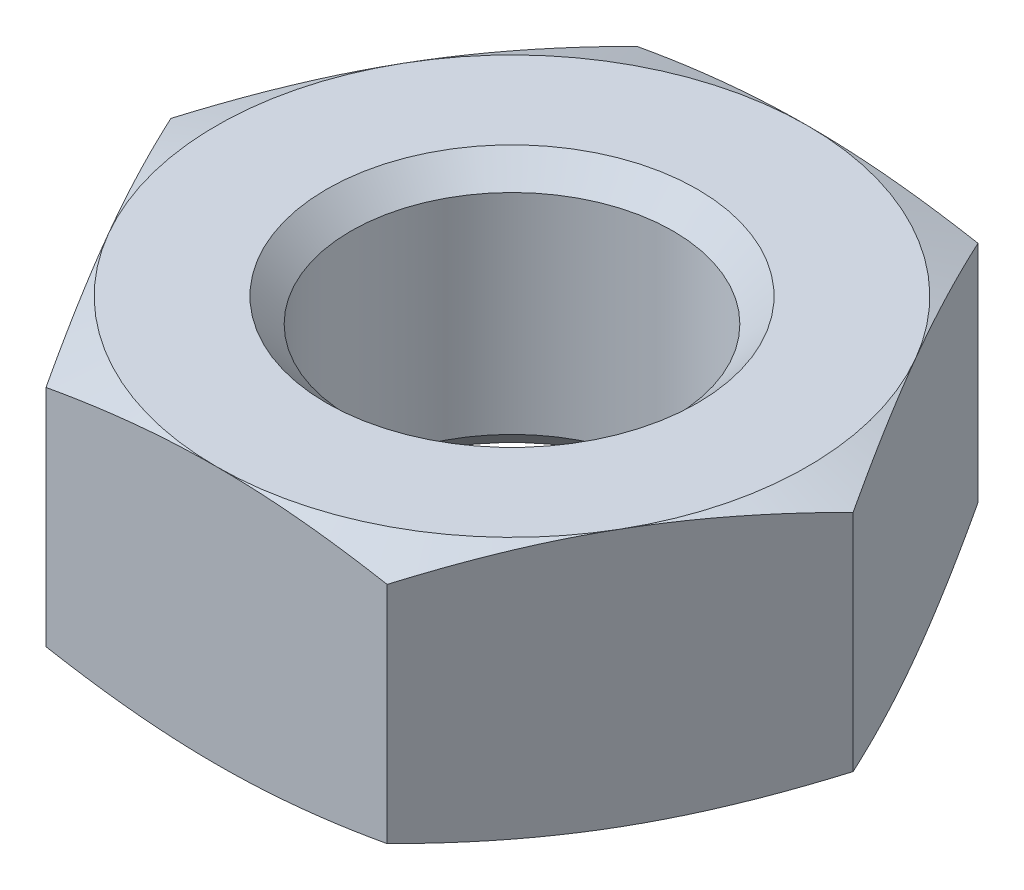
ISO-10303-21;
HEADER;
FILE_DESCRIPTION(('STEP AP214'),'2;1');
FILE_NAME('part.step','',(''),(''),'','','');
FILE_SCHEMA(('AUTOMOTIVE_DESIGN { 1 0 10303 214 1 1 1 1 }'));
ENDSEC;
DATA;
#1=APPLICATION_CONTEXT('core data for automotive mechanical design processes');
#2=APPLICATION_PROTOCOL_DEFINITION('international standard','automotive_design',2000,#1);
#3=PRODUCT_CONTEXT('',#1,'mechanical');
#4=PRODUCT('Part','Part','',(#3));
#5=PRODUCT_RELATED_PRODUCT_CATEGORY('part','',(#4));
#6=PRODUCT_DEFINITION_FORMATION('','',#4);
#7=PRODUCT_DEFINITION_CONTEXT('part definition',#1,'design');
#8=PRODUCT_DEFINITION('design','',#6,#7);
#9=PRODUCT_DEFINITION_SHAPE('','',#8);
#10=(LENGTH_UNIT() NAMED_UNIT(*) SI_UNIT(.MILLI.,.METRE.));
#11=(NAMED_UNIT(*) PLANE_ANGLE_UNIT() SI_UNIT($,.RADIAN.));
#12=(NAMED_UNIT(*) SI_UNIT($,.STERADIAN.) SOLID_ANGLE_UNIT());
#13=UNCERTAINTY_MEASURE_WITH_UNIT(LENGTH_MEASURE(1.E-05),#10,'distance_accuracy_value','');
#14=(GEOMETRIC_REPRESENTATION_CONTEXT(3) GLOBAL_UNCERTAINTY_ASSIGNED_CONTEXT((#13)) GLOBAL_UNIT_ASSIGNED_CONTEXT((#10,
#11,#12)) REPRESENTATION_CONTEXT('',''));
#15=CARTESIAN_POINT('',(0.,0.,0.));
#16=DIRECTION('',(0.,0.,1.));
#17=DIRECTION('',(1.,0.,0.));
#18=AXIS2_PLACEMENT_3D('',#15,#16,#17);
#19=CARTESIAN_POINT('',(1.587713240271,0.,2.75));
#20=DIRECTION('',(0.866025403784429,0.,0.500000000000017));
#21=DIRECTION('',(0.,-1.,0.));
#22=AXIS2_PLACEMENT_3D('',#19,#20,#21);
#23=PLANE('',#22);
#24=CARTESIAN_POINT('',(1.58771324026988,0.154842575777853,2.75000000000194));
#25=CARTESIAN_POINT('',(2.01313972089192,-1.79459256801417E-11,2.01313972067937));
#26=CARTESIAN_POINT('',(2.38156986055307,1.05739088548212E-11,1.3749999997466));
#27=(BOUNDED_CURVE() B_SPLINE_CURVE(2,(#24,#25,#26),.UNSPECIFIED.,.F.,
.F.) B_SPLINE_CURVE_WITH_KNOTS((3,3),(-1.63948333347943,-1.22556115981672),
.UNSPECIFIED.) CURVE() GEOMETRIC_REPRESENTATION_ITEM() RATIONAL_B_SPLINE_CURVE((2.50470126938003,
2.69844058684522,2.69844058680677)) REPRESENTATION_ITEM(''));
#28=CARTESIAN_POINT('',(1.58771324027139,0.15484257577773,2.75000000000067));
#29=VERTEX_POINT('',#28);
#30=CARTESIAN_POINT('',(2.38156986051846,2.84217500879855E-11,1.37499999985558));
#31=VERTEX_POINT('',#30);
#32=EDGE_CURVE('E356',#29,#31,#27,.T.);
#33=ORIENTED_EDGE('',*,*,#32,.T.);
#34=CARTESIAN_POINT('',(2.38156986055307,1.05739088548212E-11,1.3749999997466));
#35=CARTESIAN_POINT('',(2.75000000007855,3.90938809102792E-11,0.736860279048808));
#36=CARTESIAN_POINT('',(3.17542648054396,0.154842575777903,-2.45794130877548E-12));
#37=(BOUNDED_CURVE() B_SPLINE_CURVE(2,(#34,#35,#36),.UNSPECIFIED.,.F.,
.F.) B_SPLINE_CURVE_WITH_KNOTS((3,3),(-1.22556115981672,-0.811638986318215),
.UNSPECIFIED.) CURVE() GEOMETRIC_REPRESENTATION_ITEM() RATIONAL_B_SPLINE_CURVE((2.69844058680677,
2.69844058676833,2.50470126937997)) REPRESENTATION_ITEM(''));
#38=CARTESIAN_POINT('',(3.17542648054322,0.154842575777633,-7.75972364879314E-13));
#39=VERTEX_POINT('',#38);
#40=EDGE_CURVE('E347',#31,#39,#37,.T.);
#41=ORIENTED_EDGE('',*,*,#40,.T.);
#42=DIRECTION('',(0.,-1.,0.));
#43=VECTOR('',#42,1.);
#44=CARTESIAN_POINT('',(3.175426480543,0.,0.));
#45=LINE('',#44,#43);
#46=CARTESIAN_POINT('',(3.17542648050373,2.24515742435737,3.84921201960077E-09));
#47=VERTEX_POINT('',#46);
#48=EDGE_CURVE('E290',#47,#39,#45,.T.);
#49=ORIENTED_EDGE('',*,*,#48,.F.);
#50=CARTESIAN_POINT('',(2.38156986055307,2.40000000002772,1.3749999997466));
#51=CARTESIAN_POINT('',(2.74999999871458,2.3999999999992,0.736860281411279));
#52=CARTESIAN_POINT('',(3.17542647715035,2.24515742546731,5.87545311471844E-09));
#53=(BOUNDED_CURVE() B_SPLINE_CURVE(2,(#50,#51,#52),.UNSPECIFIED.,.F.,
.F.) B_SPLINE_CURVE_WITH_KNOTS((3,3),(1.2255611598137,1.63948333173724),
.UNSPECIFIED.) CURVE() GEOMETRIC_REPRESENTATION_ITEM() RATIONAL_B_SPLINE_CURVE((2.69844058649833,
2.69844058645989,2.50470127052817)) REPRESENTATION_ITEM(''));
#54=CARTESIAN_POINT('',(2.38156986051847,2.40000000000987,1.37499999985558));
#55=VERTEX_POINT('',#54);
#56=EDGE_CURVE('E28',#55,#47,#53,.T.);
#57=ORIENTED_EDGE('',*,*,#56,.F.);
#58=CARTESIAN_POINT('',(1.58771324026949,2.24515742423204,2.75000000000262));
#59=CARTESIAN_POINT('',(2.01313972089177,2.40000000005624,2.01313972067965));
#60=CARTESIAN_POINT('',(2.38156986055307,2.40000000002772,1.3749999997466));
#61=(BOUNDED_CURVE() B_SPLINE_CURVE(2,(#58,#59,#60),.UNSPECIFIED.,.F.,
.F.) B_SPLINE_CURVE_WITH_KNOTS((3,3),(0.811638986193381,1.2255611598137),
.UNSPECIFIED.) CURVE() GEOMETRIC_REPRESENTATION_ITEM() RATIONAL_B_SPLINE_CURVE((2.50470126909357,
2.69844058653678,2.69844058649833)) REPRESENTATION_ITEM(''));
#62=CARTESIAN_POINT('',(1.58771324027039,2.24515742423237,2.75000000000105));
#63=VERTEX_POINT('',#62);
#64=EDGE_CURVE('E11',#63,#55,#61,.T.);
#65=ORIENTED_EDGE('',*,*,#64,.F.);
#66=DIRECTION('',(0.,1.,0.));
#67=VECTOR('',#66,1.);
#68=CARTESIAN_POINT('',(1.587713240271,0.,2.75));
#69=LINE('',#68,#67);
#70=EDGE_CURVE('E226',#29,#63,#69,.T.);
#71=ORIENTED_EDGE('',*,*,#70,.F.);
#72=EDGE_LOOP('',(#33,#41,#49,#57,#65,#71));
#73=FACE_BOUND('',#72,.T.);
#74=ADVANCED_FACE('F17',(#73),#23,.T.);
#75=CARTESIAN_POINT('',(0.,2.24422836879512,0.));
#76=DIRECTION('',(0.,-1.,0.));
#77=DIRECTION('',(0.,0.,-1.));
#78=AXIS2_PLACEMENT_3D('',#75,#76,#77);
#79=CONICAL_SURFACE('',#78,3.17797903937844,1.22173047637774);
#80=CARTESIAN_POINT('',(1.58771324027227,2.24515742423236,2.75));
#81=CARTESIAN_POINT('',(0.736860279185908,2.40000000002758,2.75));
#82=CARTESIAN_POINT('',(0.,2.40000000002758,2.75));
#83=(BOUNDED_CURVE() B_SPLINE_CURVE(2,(#80,#81,#82),.UNSPECIFIED.,.F.,
.F.) B_SPLINE_CURVE_WITH_KNOTS((3,3),(0.811638986187635,1.22556115972299),
.UNSPECIFIED.) CURVE() GEOMETRIC_REPRESENTATION_ITEM() RATIONAL_B_SPLINE_CURVE((2.50470126908056,
2.69844058648372,2.69844058648372)) REPRESENTATION_ITEM(''));
#84=CARTESIAN_POINT('',(0.,2.40000000001873,2.75000000002433));
#85=VERTEX_POINT('',#84);
#86=EDGE_CURVE('E219',#63,#85,#83,.T.);
#87=ORIENTED_EDGE('',*,*,#86,.F.);
#88=ORIENTED_EDGE('',*,*,#64,.T.);
#89=CARTESIAN_POINT('',(0.,2.40000000000987,0.));
#90=DIRECTION('',(0.,1.,0.));
#91=DIRECTION('',(0.,0.,-1.));
#92=AXIS2_PLACEMENT_3D('',#89,#90,#91);
#93=CIRCLE('',#92,2.75000000004866);
#94=EDGE_CURVE('E200',#85,#55,#93,.T.);
#95=ORIENTED_EDGE('',*,*,#94,.F.);
#96=EDGE_LOOP('',(#87,#88,#95));
#97=FACE_BOUND('',#96,.T.);
#98=ADVANCED_FACE('F527',(#97),#79,.T.);
#99=CARTESIAN_POINT('',(0.,2.24422836879512,0.));
#100=DIRECTION('',(0.,-1.,0.));
#101=DIRECTION('',(0.,0.,-1.));
#102=AXIS2_PLACEMENT_3D('',#99,#100,#101);
#103=CONICAL_SURFACE('',#102,3.17797903937844,1.22173047637774);
#104=ORIENTED_EDGE('',*,*,#56,.T.);
#105=CARTESIAN_POINT('',(2.38156986055342,2.40000000002757,-1.3749999997468));
#106=CARTESIAN_POINT('',(2.75000000139461,2.39999999999905,-0.736860276770116));
#107=CARTESIAN_POINT('',(3.17542648381784,2.24515742304054,5.67218316571169E-09));
#108=(BOUNDED_CURVE() B_SPLINE_CURVE(2,(#105,#106,#107),.UNSPECIFIED.,.F.,
.F.) B_SPLINE_CURVE_WITH_KNOTS((3,3),(1.22556115981364,1.63948333474769),
.UNSPECIFIED.) CURVE() GEOMETRIC_REPRESENTATION_ITEM() RATIONAL_B_SPLINE_CURVE((2.69844058649794,
2.69844058645949,2.50470126770962)) REPRESENTATION_ITEM(''));
#109=CARTESIAN_POINT('',(2.38156986051864,2.40000000000987,-1.37499999985568));
#110=VERTEX_POINT('',#109);
#111=EDGE_CURVE('E98',#110,#47,#108,.T.);
#112=ORIENTED_EDGE('',*,*,#111,.F.);
#113=CARTESIAN_POINT('',(0.,2.40000000000987,0.));
#114=DIRECTION('',(0.,1.,0.));
#115=DIRECTION('',(0.,0.,-1.));
#116=AXIS2_PLACEMENT_3D('',#113,#114,#115);
#117=CIRCLE('',#116,2.75000000004866);
#118=EDGE_CURVE('E206',#55,#110,#117,.T.);
#119=ORIENTED_EDGE('',*,*,#118,.F.);
#120=EDGE_LOOP('',(#104,#112,#119));
#121=FACE_BOUND('',#120,.T.);
#122=ADVANCED_FACE('F526',(#121),#103,.T.);
#123=CARTESIAN_POINT('',(0.,2.24422836879512,0.));
#124=DIRECTION('',(0.,-1.,0.));
#125=DIRECTION('',(0.,0.,-1.));
#126=AXIS2_PLACEMENT_3D('',#123,#124,#125);
#127=CONICAL_SURFACE('',#126,3.17797903937844,1.22173047637774);
#128=CARTESIAN_POINT('',(1.58771324027013,2.24515742423203,-2.7500000000023));
#129=CARTESIAN_POINT('',(2.01313972089222,2.40000000005609,-2.01313972067965));
#130=CARTESIAN_POINT('',(2.38156986055342,2.40000000002757,-1.3749999997468));
#131=(BOUNDED_CURVE() B_SPLINE_CURVE(2,(#128,#129,#130),.UNSPECIFIED.,.F.,
.F.) B_SPLINE_CURVE_WITH_KNOTS((3,3),(0.811638986193514,1.22556115981364),
.UNSPECIFIED.) CURVE() GEOMETRIC_REPRESENTATION_ITEM() RATIONAL_B_SPLINE_CURVE((2.50470126909338,
2.69844058653638,2.69844058649794)) REPRESENTATION_ITEM(''));
#132=CARTESIAN_POINT('',(1.58771324027185,2.24515742423208,-2.75000000000114));
#133=VERTEX_POINT('',#132);
#134=EDGE_CURVE('E270',#133,#110,#131,.T.);
#135=ORIENTED_EDGE('',*,*,#134,.F.);
#136=CARTESIAN_POINT('',(1.58771324027373,2.2451574242321,-2.75));
#137=CARTESIAN_POINT('',(0.736860279186496,2.40000000002758,-2.75));
#138=CARTESIAN_POINT('',(0.,2.40000000002758,-2.75));
#139=(BOUNDED_CURVE() B_SPLINE_CURVE(2,(#136,#137,#138),.UNSPECIFIED.,.F.,
.F.) B_SPLINE_CURVE_WITH_KNOTS((3,3),(-1.63948333325867,-1.22556115972299),
.UNSPECIFIED.) CURVE() GEOMETRIC_REPRESENTATION_ITEM() RATIONAL_B_SPLINE_CURVE((2.50470126908025,
2.69844058648372,2.69844058648372)) REPRESENTATION_ITEM(''));
#140=CARTESIAN_POINT('',(0.,2.40000000001873,-2.75000000002433));
#141=VERTEX_POINT('',#140);
#142=EDGE_CURVE('E167',#133,#141,#139,.T.);
#143=ORIENTED_EDGE('',*,*,#142,.T.);
#144=CARTESIAN_POINT('',(0.,2.40000000000987,0.));
#145=DIRECTION('',(0.,1.,0.));
#146=DIRECTION('',(0.,0.,-1.));
#147=AXIS2_PLACEMENT_3D('',#144,#145,#146);
#148=CIRCLE('',#147,2.75000000004866);
#149=EDGE_CURVE('E380',#110,#141,#148,.T.);
#150=ORIENTED_EDGE('',*,*,#149,.F.);
#151=EDGE_LOOP('',(#135,#143,#150));
#152=FACE_BOUND('',#151,.T.);
#153=ADVANCED_FACE('F525',(#152),#127,.T.);
#154=CARTESIAN_POINT('',(0.,2.24422836879512,0.));
#155=DIRECTION('',(0.,-1.,0.));
#156=DIRECTION('',(0.,0.,-1.));
#157=AXIS2_PLACEMENT_3D('',#154,#155,#156);
#158=CONICAL_SURFACE('',#157,3.17797903937844,1.22173047637774);
#159=CARTESIAN_POINT('',(0.,2.40000000002758,-2.75));
#160=CARTESIAN_POINT('',(-0.73686027637031,2.40000000002758,-2.75));
#161=CARTESIAN_POINT('',(-1.58771323326697,2.24515742550722,-2.75));
#162=(BOUNDED_CURVE() B_SPLINE_CURVE(2,(#159,#160,#161),.UNSPECIFIED.,.F.,
.F.) B_SPLINE_CURVE_WITH_KNOTS((3,3),(-1.22556115972299,-0.811638987769262),
.UNSPECIFIED.) CURVE() GEOMETRIC_REPRESENTATION_ITEM() RATIONAL_B_SPLINE_CURVE((2.69844058648372,
2.69844058648372,2.50470127056114)) REPRESENTATION_ITEM(''));
#163=CARTESIAN_POINT('',(-1.58771323689944,2.24515742464228,-2.75000000179593));
#164=VERTEX_POINT('',#163);
#165=EDGE_CURVE('E217',#141,#164,#162,.T.);
#166=ORIENTED_EDGE('',*,*,#165,.T.);
#167=CARTESIAN_POINT('',(-1.58771323716036,2.24515742310041,-2.75000000538778));
#168=CARTESIAN_POINT('',(-2.01313971964214,2.40000000005624,-2.01313972284407));
#169=CARTESIAN_POINT('',(-2.38156986055307,2.40000000002772,-1.3749999997466));
#170=(BOUNDED_CURVE() B_SPLINE_CURVE(2,(#167,#168,#169),.UNSPECIFIED.,.F.,
.F.) B_SPLINE_CURVE_WITH_KNOTS((3,3),(-1.63948333468148,-1.22556115965561),
.UNSPECIFIED.) CURVE() GEOMETRIC_REPRESENTATION_ITEM() RATIONAL_B_SPLINE_CURVE((2.50470126778893,
2.69844058654712,2.69844058650868)) REPRESENTATION_ITEM(''));
#171=CARTESIAN_POINT('',(-2.38156986051847,2.40000000000987,-1.37499999985557));
#172=VERTEX_POINT('',#171);
#173=EDGE_CURVE('E218',#164,#172,#170,.T.);
#174=ORIENTED_EDGE('',*,*,#173,.T.);
#175=CARTESIAN_POINT('',(0.,2.40000000000987,0.));
#176=DIRECTION('',(0.,1.,0.));
#177=DIRECTION('',(0.,0.,-1.));
#178=AXIS2_PLACEMENT_3D('',#175,#176,#177);
#179=CIRCLE('',#178,2.75000000004866);
#180=EDGE_CURVE('E278',#141,#172,#179,.T.);
#181=ORIENTED_EDGE('',*,*,#180,.F.);
#182=EDGE_LOOP('',(#166,#174,#181));
#183=FACE_BOUND('',#182,.T.);
#184=ADVANCED_FACE('F519',(#183),#158,.T.);
#185=CARTESIAN_POINT('',(0.,2.24422836879512,0.));
#186=DIRECTION('',(0.,-1.,0.));
#187=DIRECTION('',(0.,0.,-1.));
#188=AXIS2_PLACEMENT_3D('',#185,#186,#187);
#189=CONICAL_SURFACE('',#188,3.17797903937844,1.22173047637774);
#190=CARTESIAN_POINT('',(-2.38156986055307,2.40000000002772,-1.3749999997466));
#191=CARTESIAN_POINT('',(-2.74999999867052,2.3999999999992,-0.73686028148758));
#192=CARTESIAN_POINT('',(-3.17542647704074,2.24515742550721,-6.06529224605319E-09));
#193=(BOUNDED_CURVE() B_SPLINE_CURVE(2,(#190,#191,#192),.UNSPECIFIED.,.F.,
.F.) B_SPLINE_CURVE_WITH_KNOTS((3,3),(-1.22556115965561,-0.811638987779946),
.UNSPECIFIED.) CURVE() GEOMETRIC_REPRESENTATION_ITEM() RATIONAL_B_SPLINE_CURVE((2.69844058650868,
2.69844058647023,2.5047012705841)) REPRESENTATION_ITEM(''));
#194=CARTESIAN_POINT('',(-3.17542648041227,2.24515742464226,-3.81749868933998E-09));
#195=VERTEX_POINT('',#194);
#196=EDGE_CURVE('E246',#172,#195,#193,.T.);
#197=ORIENTED_EDGE('',*,*,#196,.T.);
#198=CARTESIAN_POINT('',(-3.17542648365342,2.24515742310039,-5.38740257120665E-09));
#199=CARTESIAN_POINT('',(-2.75000000132853,2.39999999999905,0.736860276884577));
#200=CARTESIAN_POINT('',(-2.38156986055341,2.40000000002757,1.3749999997468));
#201=(BOUNDED_CURVE() B_SPLINE_CURVE(2,(#198,#199,#200),.UNSPECIFIED.,.F.,
.F.) B_SPLINE_CURVE_WITH_KNOTS((3,3),(-1.63948333467344,-1.22556115981364),
.UNSPECIFIED.) CURVE() GEOMETRIC_REPRESENTATION_ITEM() RATIONAL_B_SPLINE_CURVE((2.50470126777912,
2.69844058645949,2.69844058649794)) REPRESENTATION_ITEM(''));
#202=CARTESIAN_POINT('',(-2.38156986051864,2.40000000000987,1.37499999985568));
#203=VERTEX_POINT('',#202);
#204=EDGE_CURVE('E365',#195,#203,#201,.T.);
#205=ORIENTED_EDGE('',*,*,#204,.T.);
#206=CARTESIAN_POINT('',(0.,2.40000000000987,0.));
#207=DIRECTION('',(0.,1.,0.));
#208=DIRECTION('',(0.,0.,-1.));
#209=AXIS2_PLACEMENT_3D('',#206,#207,#208);
#210=CIRCLE('',#209,2.75000000004866);
#211=EDGE_CURVE('E309',#172,#203,#210,.T.);
#212=ORIENTED_EDGE('',*,*,#211,.F.);
#213=EDGE_LOOP('',(#197,#205,#212));
#214=FACE_BOUND('',#213,.T.);
#215=ADVANCED_FACE('F542',(#214),#189,.T.);
#216=CARTESIAN_POINT('',(0.,2.24422836879512,0.));
#217=DIRECTION('',(0.,-1.,0.));
#218=DIRECTION('',(0.,0.,-1.));
#219=AXIS2_PLACEMENT_3D('',#216,#217,#218);
#220=CONICAL_SURFACE('',#219,3.17797903937844,1.22173047637774);
#221=CARTESIAN_POINT('',(-2.38156986055341,2.40000000002757,1.3749999997468));
#222=CARTESIAN_POINT('',(-2.01313972225636,2.40000000005609,2.0131397183169));
#223=CARTESIAN_POINT('',(-1.58771324366415,2.24515742546735,2.74999999412369));
#224=(BOUNDED_CURVE() B_SPLINE_CURVE(2,(#221,#222,#223),.UNSPECIFIED.,.F.,
.F.) B_SPLINE_CURVE_WITH_KNOTS((3,3),(-1.22556115981364,-0.811638987726087),
.UNSPECIFIED.) CURVE() GEOMETRIC_REPRESENTATION_ITEM() RATIONAL_B_SPLINE_CURVE((2.69844058649794,
2.69844058653638,2.50470127052804)) REPRESENTATION_ITEM(''));
#225=CARTESIAN_POINT('',(-1.58771324358581,2.2451574243574,2.7499999980413));
#226=VERTEX_POINT('',#225);
#227=EDGE_CURVE('E252',#203,#226,#224,.T.);
#228=ORIENTED_EDGE('',*,*,#227,.T.);
#229=CARTESIAN_POINT('',(0.,2.40000000002758,2.75));
#230=CARTESIAN_POINT('',(-0.736860281818377,2.40000000002758,2.75));
#231=CARTESIAN_POINT('',(-1.58771324682194,2.24515742304042,2.75));
#232=(BOUNDED_CURVE() B_SPLINE_CURVE(2,(#229,#230,#231),.UNSPECIFIED.,.F.,
.F.) B_SPLINE_CURVE_WITH_KNOTS((3,3),(1.22556115972299,1.6394833347371),
.UNSPECIFIED.) CURVE() GEOMETRIC_REPRESENTATION_ITEM() RATIONAL_B_SPLINE_CURVE((2.69844058648372,
2.69844058648372,2.50470126769627)) REPRESENTATION_ITEM(''));
#233=EDGE_CURVE('E225',#85,#226,#232,.T.);
#234=ORIENTED_EDGE('',*,*,#233,.F.);
#235=CARTESIAN_POINT('',(0.,2.40000000000987,0.));
#236=DIRECTION('',(0.,1.,0.));
#237=DIRECTION('',(0.,0.,-1.));
#238=AXIS2_PLACEMENT_3D('',#235,#236,#237);
#239=CIRCLE('',#238,2.75000000004866);
#240=EDGE_CURVE('E207',#203,#85,#239,.T.);
#241=ORIENTED_EDGE('',*,*,#240,.F.);
#242=EDGE_LOOP('',(#228,#234,#241));
#243=FACE_BOUND('',#242,.T.);
#244=ADVANCED_FACE('F490',(#243),#220,.T.);
#245=CARTESIAN_POINT('',(-1.587713240271,0.,2.75));
#246=DIRECTION('',(0.,0.,1.));
#247=DIRECTION('',(1.,0.,0.));
#248=AXIS2_PLACEMENT_3D('',#245,#246,#247);
#249=PLANE('',#248);
#250=DIRECTION('',(0.,1.,0.));
#251=VECTOR('',#250,1.);
#252=CARTESIAN_POINT('',(-1.58771324027134,0.,2.7500000000002));
#253=LINE('',#252,#251);
#254=CARTESIAN_POINT('',(-1.58771324027167,0.154842575777809,2.75000000000076));
#255=VERTEX_POINT('',#254);
#256=EDGE_CURVE('E170',#255,#226,#253,.T.);
#257=ORIENTED_EDGE('',*,*,#256,.F.);
#258=CARTESIAN_POINT('',(-1.58771324027352,0.154842575777905,2.75));
#259=CARTESIAN_POINT('',(-0.736860279186411,1.0711536054089E-11,2.75));
#260=CARTESIAN_POINT('',(0.,1.07115326322058E-11,2.75));
#261=(BOUNDED_CURVE() B_SPLINE_CURVE(2,(#258,#259,#260),.UNSPECIFIED.,.F.,
.F.) B_SPLINE_CURVE_WITH_KNOTS((3,3),(-1.63948333346977,-1.22556115989129),
.UNSPECIFIED.) CURVE() GEOMETRIC_REPRESENTATION_ITEM() RATIONAL_B_SPLINE_CURVE((2.50470126936817,
2.69844058679386,2.69844058679386)) REPRESENTATION_ITEM(''));
#262=CARTESIAN_POINT('',(0.,1.95666056305153E-11,2.75000000002433));
#263=VERTEX_POINT('',#262);
#264=EDGE_CURVE('E237',#255,#263,#261,.T.);
#265=ORIENTED_EDGE('',*,*,#264,.T.);
#266=CARTESIAN_POINT('',(0.,1.07115326322058E-11,2.75));
#267=CARTESIAN_POINT('',(0.736860279186299,1.07116537861884E-11,2.75));
#268=CARTESIAN_POINT('',(1.58771324027324,0.154842575777855,2.75));
#269=(BOUNDED_CURVE() B_SPLINE_CURVE(2,(#266,#267,#268),.UNSPECIFIED.,.F.,
.F.) B_SPLINE_CURVE_WITH_KNOTS((3,3),(-1.22556115989129,-0.811638986312882),
.UNSPECIFIED.) CURVE() GEOMETRIC_REPRESENTATION_ITEM() RATIONAL_B_SPLINE_CURVE((2.69844058679386,
2.69844058679386,2.50470126936823)) REPRESENTATION_ITEM(''));
#270=EDGE_CURVE('E364',#263,#29,#269,.T.);
#271=ORIENTED_EDGE('',*,*,#270,.T.);
#272=ORIENTED_EDGE('',*,*,#70,.T.);
#273=ORIENTED_EDGE('',*,*,#86,.T.);
#274=ORIENTED_EDGE('',*,*,#233,.T.);
#275=EDGE_LOOP('',(#257,#265,#271,#272,#273,#274));
#276=FACE_BOUND('',#275,.T.);
#277=ADVANCED_FACE('F486',(#276),#249,.T.);
#278=CARTESIAN_POINT('',(3.175426480543,0.,0.));
#279=DIRECTION('',(0.866025403784429,0.,-0.500000000000017));
#280=DIRECTION('',(0.,-1.,0.));
#281=AXIS2_PLACEMENT_3D('',#278,#279,#280);
#282=PLANE('',#281);
#283=CARTESIAN_POINT('',(3.17542648054364,0.154842575777787,1.11381283284483E-12));
#284=CARTESIAN_POINT('',(2.75000000007864,3.92385890261248E-11,-0.73686027904945));
#285=CARTESIAN_POINT('',(2.38156986055342,1.07180332529765E-11,-1.37499999974679));
#286=(BOUNDED_CURVE() B_SPLINE_CURVE(2,(#283,#284,#285),.UNSPECIFIED.,.F.,
.F.) B_SPLINE_CURVE_WITH_KNOTS((3,3),(-1.63948333347906,-1.22556115998092),
.UNSPECIFIED.) CURVE() GEOMETRIC_REPRESENTATION_ITEM() RATIONAL_B_SPLINE_CURVE((2.50470126937992,
2.69844058676792,2.69844058680636)) REPRESENTATION_ITEM(''));
#287=CARTESIAN_POINT('',(2.38156986051864,2.84218178506213E-11,-1.37499999985567));
#288=VERTEX_POINT('',#287);
#289=EDGE_CURVE('E175',#39,#288,#286,.T.);
#290=ORIENTED_EDGE('',*,*,#289,.T.);
#291=CARTESIAN_POINT('',(2.38156986055342,1.07180332529765E-11,-1.37499999974679));
#292=CARTESIAN_POINT('',(2.01313972089219,-1.78025372221668E-11,-2.0131397206797));
#293=CARTESIAN_POINT('',(1.58771324027006,0.154842575778039,-2.75000000000243));
#294=(BOUNDED_CURVE() B_SPLINE_CURVE(2,(#291,#292,#293),.UNSPECIFIED.,.F.,
.F.) B_SPLINE_CURVE_WITH_KNOTS((3,3),(-1.22556115998092,-0.811638986318188),
.UNSPECIFIED.) CURVE() GEOMETRIC_REPRESENTATION_ITEM() RATIONAL_B_SPLINE_CURVE((2.69844058680636,
2.69844058684481,2.50470126937963)) REPRESENTATION_ITEM(''));
#295=CARTESIAN_POINT('',(1.58771324027079,0.154842575777649,-2.75000000000076));
#296=VERTEX_POINT('',#295);
#297=EDGE_CURVE('E172',#288,#296,#294,.T.);
#298=ORIENTED_EDGE('',*,*,#297,.T.);
#299=DIRECTION('',(0.,-1.,0.));
#300=VECTOR('',#299,1.);
#301=CARTESIAN_POINT('',(1.587713240271,0.,-2.75));
#302=LINE('',#301,#300);
#303=EDGE_CURVE('E21',#133,#296,#302,.T.);
#304=ORIENTED_EDGE('',*,*,#303,.F.);
#305=ORIENTED_EDGE('',*,*,#134,.T.);
#306=ORIENTED_EDGE('',*,*,#111,.T.);
#307=ORIENTED_EDGE('',*,*,#48,.T.);
#308=EDGE_LOOP('',(#290,#298,#304,#305,#306,#307));
#309=FACE_BOUND('',#308,.T.);
#310=ADVANCED_FACE('F173',(#309),#282,.T.);
#311=CARTESIAN_POINT('',(0.,2.4,0.));
#312=DIRECTION('',(0.,1.,0.));
#313=DIRECTION('',(1.,0.,0.));
#314=AXIS2_PLACEMENT_3D('',#311,#312,#313);
#315=PLANE('',#314);
#316=CARTESIAN_POINT('',(0.,2.39999999996598,0.));
#317=DIRECTION('',(0.,-1.,0.));
#318=DIRECTION('',(0.,0.,1.));
#319=AXIS2_PLACEMENT_3D('',#316,#317,#318);
#320=CIRCLE('',#319,1.72499999996489);
#321=CARTESIAN_POINT('',(0.,2.39999999996598,-1.72499999996489));
#322=VERTEX_POINT('',#321);
#323=EDGE_CURVE('E330',#322,#322,#320,.T.);
#324=ORIENTED_EDGE('',*,*,#323,.T.);
#325=EDGE_LOOP('',(#324));
#326=FACE_BOUND('',#325,.T.);
#327=ORIENTED_EDGE('',*,*,#211,.T.);
#328=ORIENTED_EDGE('',*,*,#240,.T.);
#329=ORIENTED_EDGE('',*,*,#94,.T.);
#330=ORIENTED_EDGE('',*,*,#118,.T.);
#331=ORIENTED_EDGE('',*,*,#149,.T.);
#332=ORIENTED_EDGE('',*,*,#180,.T.);
#333=EDGE_LOOP('',(#327,#328,#329,#330,#331,#332));
#334=FACE_BOUND('',#333,.T.);
#335=ADVANCED_FACE('F523',(#326,#334),#315,.T.);
#336=CARTESIAN_POINT('',(-3.175426480543,0.,0.));
#337=DIRECTION('',(-0.866025403784429,0.,0.500000000000017));
#338=DIRECTION('',(0.,1.,0.));
#339=AXIS2_PLACEMENT_3D('',#336,#337,#338);
#340=PLANE('',#339);
#341=CARTESIAN_POINT('',(-3.17542648054415,0.154842575777971,-1.98968602517947E-12));
#342=CARTESIAN_POINT('',(-2.75000000007884,3.92390079866935E-11,0.736860279049099));
#343=CARTESIAN_POINT('',(-2.38156986055342,1.07186092568443E-11,1.37499999974679));
#344=(BOUNDED_CURVE() B_SPLINE_CURVE(2,(#341,#342,#343),.UNSPECIFIED.,.F.,
.F.) B_SPLINE_CURVE_WITH_KNOTS((3,3),(-1.63948333348065,-1.225561159982),
.UNSPECIFIED.) CURVE() GEOMETRIC_REPRESENTATION_ITEM() RATIONAL_B_SPLINE_CURVE((2.50470126938138,
2.69844058676972,2.69844058680816)) REPRESENTATION_ITEM(''));
#345=CARTESIAN_POINT('',(-3.17542648054316,0.154842575777611,-4.73188375000768E-13));
#346=VERTEX_POINT('',#345);
#347=CARTESIAN_POINT('',(-2.38156986051864,2.84218178506213E-11,1.37499999985567));
#348=VERTEX_POINT('',#347);
#349=EDGE_CURVE('E269',#346,#348,#344,.T.);
#350=ORIENTED_EDGE('',*,*,#349,.T.);
#351=CARTESIAN_POINT('',(-2.38156986055342,1.07186092568443E-11,1.37499999974679));
#352=CARTESIAN_POINT('',(-2.01313972089228,-1.78018155772008E-11,2.01313972067956));
#353=CARTESIAN_POINT('',(-1.58771324027026,0.154842575777967,2.75000000000208));
#354=(BOUNDED_CURVE() B_SPLINE_CURVE(2,(#351,#352,#353),.UNSPECIFIED.,.F.,
.F.) B_SPLINE_CURVE_WITH_KNOTS((3,3),(-1.225561159982,-0.811638986319074),
.UNSPECIFIED.) CURVE() GEOMETRIC_REPRESENTATION_ITEM() RATIONAL_B_SPLINE_CURVE((2.69844058680816,
2.69844058684661,2.50470126938138)) REPRESENTATION_ITEM(''));
#355=EDGE_CURVE('E227',#348,#255,#354,.T.);
#356=ORIENTED_EDGE('',*,*,#355,.T.);
#357=ORIENTED_EDGE('',*,*,#256,.T.);
#358=ORIENTED_EDGE('',*,*,#227,.F.);
#359=ORIENTED_EDGE('',*,*,#204,.F.);
#360=DIRECTION('',(0.,1.,0.));
#361=VECTOR('',#360,1.);
#362=CARTESIAN_POINT('',(-3.17542648054266,0.,1.99059518868339E-13));
#363=LINE('',#362,#361);
#364=EDGE_CURVE('E236',#346,#195,#363,.T.);
#365=ORIENTED_EDGE('',*,*,#364,.F.);
#366=EDGE_LOOP('',(#350,#356,#357,#358,#359,#365));
#367=FACE_BOUND('',#366,.T.);
#368=ADVANCED_FACE('F492',(#367),#340,.T.);
#369=CARTESIAN_POINT('',(1.587713240271,0.,-2.75));
#370=DIRECTION('',(0.,0.,-1.));
#371=DIRECTION('',(0.,-1.,0.));
#372=AXIS2_PLACEMENT_3D('',#369,#370,#371);
#373=PLANE('',#372);
#374=CARTESIAN_POINT('',(1.58771324027265,0.154842575777746,-2.75));
#375=CARTESIAN_POINT('',(0.736860279186059,1.07109396063385E-11,-2.75));
#376=CARTESIAN_POINT('',(0.,1.07113680596639E-11,-2.75));
#377=(BOUNDED_CURVE() B_SPLINE_CURVE(2,(#374,#375,#376),.UNSPECIFIED.,.F.,
.F.) B_SPLINE_CURVE_WITH_KNOTS((3,3),(-1.63948333347075,-1.22556115989222),
.UNSPECIFIED.) CURVE() GEOMETRIC_REPRESENTATION_ITEM() RATIONAL_B_SPLINE_CURVE((2.5047012693698,
2.69844058679542,2.69844058679541)) REPRESENTATION_ITEM(''));
#378=CARTESIAN_POINT('',(0.,1.95666047603213E-11,-2.75000000002433));
#379=VERTEX_POINT('',#378);
#380=EDGE_CURVE('E163',#296,#379,#377,.T.);
#381=ORIENTED_EDGE('',*,*,#380,.T.);
#382=CARTESIAN_POINT('',(0.,1.07113680596639E-11,-2.75));
#383=CARTESIAN_POINT('',(-0.736860281440046,1.07119452197324E-11,-2.75));
#384=CARTESIAN_POINT('',(-1.58771324588064,0.154842576798317,-2.75));
#385=(BOUNDED_CURVE() B_SPLINE_CURVE(2,(#382,#383,#384),.UNSPECIFIED.,.F.,
.F.) B_SPLINE_CURVE_WITH_KNOTS((3,3),(-1.22556115989222,-0.811638985047557),
.UNSPECIFIED.) CURVE() GEOMETRIC_REPRESENTATION_ITEM() RATIONAL_B_SPLINE_CURVE((2.69844058679542,
2.69844058679541,2.50470126818454)) REPRESENTATION_ITEM(''));
#386=CARTESIAN_POINT('',(-1.58771324292741,0.154842576221292,-2.7499999986377));
#387=VERTEX_POINT('',#386);
#388=EDGE_CURVE('E186',#379,#387,#385,.T.);
#389=ORIENTED_EDGE('',*,*,#388,.T.);
#390=DIRECTION('',(0.,-1.,0.));
#391=VECTOR('',#390,1.);
#392=CARTESIAN_POINT('',(-1.587713240271,0.,-2.75));
#393=LINE('',#392,#391);
#394=EDGE_CURVE('E211',#164,#387,#393,.T.);
#395=ORIENTED_EDGE('',*,*,#394,.F.);
#396=ORIENTED_EDGE('',*,*,#165,.F.);
#397=ORIENTED_EDGE('',*,*,#142,.F.);
#398=ORIENTED_EDGE('',*,*,#303,.T.);
#399=EDGE_LOOP('',(#381,#389,#395,#396,#397,#398));
#400=FACE_BOUND('',#399,.T.);
#401=ADVANCED_FACE('F160',(#400),#373,.T.);
#402=CARTESIAN_POINT('',(-1.587713240271,0.,-2.75));
#403=DIRECTION('',(-0.866025403784429,0.,-0.500000000000017));
#404=DIRECTION('',(-0.500000000000017,0.,0.866025403784429));
#405=AXIS2_PLACEMENT_3D('',#402,#403,#404);
#406=PLANE('',#405);
#407=CARTESIAN_POINT('',(-2.38156986065922,1.0573908866021E-11,-1.37499999956274));
#408=CARTESIAN_POINT('',(-2.01313972189763,-3.86507830454368E-11,-2.01313971893744));
#409=CARTESIAN_POINT('',(-1.58771324263058,0.154842574918629,-2.74999999591309));
#410=(BOUNDED_CURVE() B_SPLINE_CURVE(2,(#407,#408,#409),.UNSPECIFIED.,.F.,
.F.) B_SPLINE_CURVE_WITH_KNOTS((3,3),(1.22556115975709,1.63948333241345),
.UNSPECIFIED.) CURVE() GEOMETRIC_REPRESENTATION_ITEM() RATIONAL_B_SPLINE_CURVE((2.69844058680677,
2.69844058687312,2.5047012703779)) REPRESENTATION_ITEM(''));
#411=CARTESIAN_POINT('',(-2.38156986060884,1.94980094891011E-11,-1.37499999969904));
#412=VERTEX_POINT('',#411);
#413=EDGE_CURVE('E192',#412,#387,#410,.T.);
#414=ORIENTED_EDGE('',*,*,#413,.F.);
#415=CARTESIAN_POINT('',(-3.17542648054342,0.154842575777706,1.52196264838252E-12));
#416=CARTESIAN_POINT('',(-2.75000000013522,5.97986521411186E-11,-0.736860278950653));
#417=CARTESIAN_POINT('',(-2.38156986065922,1.0573908866021E-11,-1.37499999956274));
#418=(BOUNDED_CURVE() B_SPLINE_CURVE(2,(#415,#416,#417),.UNSPECIFIED.,.F.,
.F.) B_SPLINE_CURVE_WITH_KNOTS((3,3),(0.811638986318459,1.22556115975709),
.UNSPECIFIED.) CURVE() GEOMETRIC_REPRESENTATION_ITEM() RATIONAL_B_SPLINE_CURVE((2.5047012693802,
2.69844058674042,2.69844058680677)) REPRESENTATION_ITEM(''));
#419=EDGE_CURVE('E263',#346,#412,#418,.T.);
#420=ORIENTED_EDGE('',*,*,#419,.F.);
#421=ORIENTED_EDGE('',*,*,#364,.T.);
#422=ORIENTED_EDGE('',*,*,#196,.F.);
#423=ORIENTED_EDGE('',*,*,#173,.F.);
#424=ORIENTED_EDGE('',*,*,#394,.T.);
#425=EDGE_LOOP('',(#414,#420,#421,#422,#423,#424));
#426=FACE_BOUND('',#425,.T.);
#427=ADVANCED_FACE('F517',(#426),#406,.T.);
#428=CARTESIAN_POINT('',(0.,0.15577163125613,0.));
#429=DIRECTION('',(0.,1.,0.));
#430=DIRECTION('',(0.,0.,1.));
#431=AXIS2_PLACEMENT_3D('',#428,#429,#430);
#432=CONICAL_SURFACE('',#431,3.17797903949213,1.22173047643638);
#433=ORIENTED_EDGE('',*,*,#264,.F.);
#434=ORIENTED_EDGE('',*,*,#355,.F.);
#435=CARTESIAN_POINT('',(0.,2.84216823253497E-11,0.));
#436=DIRECTION('',(0.,1.,0.));
#437=DIRECTION('',(0.,0.,1.));
#438=AXIS2_PLACEMENT_3D('',#435,#436,#437);
#439=CIRCLE('',#438,2.75000000004866);
#440=EDGE_CURVE('E300',#348,#263,#439,.T.);
#441=ORIENTED_EDGE('',*,*,#440,.T.);
#442=EDGE_LOOP('',(#433,#434,#441));
#443=FACE_BOUND('',#442,.T.);
#444=ADVANCED_FACE('F496',(#443),#432,.T.);
#445=CARTESIAN_POINT('',(0.,0.15577163125613,0.));
#446=DIRECTION('',(0.,1.,0.));
#447=DIRECTION('',(0.,0.,1.));
#448=AXIS2_PLACEMENT_3D('',#445,#446,#447);
#449=CONICAL_SURFACE('',#448,3.17797903949213,1.22173047643638);
#450=ORIENTED_EDGE('',*,*,#32,.F.);
#451=ORIENTED_EDGE('',*,*,#270,.F.);
#452=CARTESIAN_POINT('',(0.,2.84216823253497E-11,0.));
#453=DIRECTION('',(0.,1.,0.));
#454=DIRECTION('',(0.,0.,1.));
#455=AXIS2_PLACEMENT_3D('',#452,#453,#454);
#456=CIRCLE('',#455,2.75000000004866);
#457=EDGE_CURVE('E296',#263,#31,#456,.T.);
#458=ORIENTED_EDGE('',*,*,#457,.T.);
#459=EDGE_LOOP('',(#450,#451,#458));
#460=FACE_BOUND('',#459,.T.);
#461=ADVANCED_FACE('F502',(#460),#449,.T.);
#462=CARTESIAN_POINT('',(0.,0.15577163125613,0.));
#463=DIRECTION('',(0.,1.,0.));
#464=DIRECTION('',(0.,0.,1.));
#465=AXIS2_PLACEMENT_3D('',#462,#463,#464);
#466=CONICAL_SURFACE('',#465,3.17797903949213,1.22173047643638);
#467=ORIENTED_EDGE('',*,*,#289,.F.);
#468=ORIENTED_EDGE('',*,*,#40,.F.);
#469=CARTESIAN_POINT('',(0.,2.84218178506213E-11,0.));
#470=DIRECTION('',(0.,1.,0.));
#471=DIRECTION('',(0.,0.,1.));
#472=AXIS2_PLACEMENT_3D('',#469,#470,#471);
#473=CIRCLE('',#472,2.75000000004866);
#474=EDGE_CURVE('E301',#31,#288,#473,.T.);
#475=ORIENTED_EDGE('',*,*,#474,.T.);
#476=EDGE_LOOP('',(#467,#468,#475));
#477=FACE_BOUND('',#476,.T.);
#478=ADVANCED_FACE('F507',(#477),#466,.T.);
#479=CARTESIAN_POINT('',(0.,0.15577163125613,0.));
#480=DIRECTION('',(0.,1.,0.));
#481=DIRECTION('',(0.,0.,1.));
#482=AXIS2_PLACEMENT_3D('',#479,#480,#481);
#483=CONICAL_SURFACE('',#482,3.17797903949213,1.22173047643638);
#484=ORIENTED_EDGE('',*,*,#380,.F.);
#485=ORIENTED_EDGE('',*,*,#297,.F.);
#486=CARTESIAN_POINT('',(0.,2.84216823253497E-11,0.));
#487=DIRECTION('',(0.,1.,0.));
#488=DIRECTION('',(0.,0.,1.));
#489=AXIS2_PLACEMENT_3D('',#486,#487,#488);
#490=CIRCLE('',#489,2.75000000004866);
#491=EDGE_CURVE('E183',#288,#379,#490,.T.);
#492=ORIENTED_EDGE('',*,*,#491,.T.);
#493=EDGE_LOOP('',(#484,#485,#492));
#494=FACE_BOUND('',#493,.T.);
#495=ADVANCED_FACE('F181',(#494),#483,.T.);
#496=CARTESIAN_POINT('',(0.,0.15577163125613,0.));
#497=DIRECTION('',(0.,1.,0.));
#498=DIRECTION('',(0.,0.,1.));
#499=AXIS2_PLACEMENT_3D('',#496,#497,#498);
#500=CONICAL_SURFACE('',#499,3.17797903949213,1.22173047643638);
#501=ORIENTED_EDGE('',*,*,#413,.T.);
#502=ORIENTED_EDGE('',*,*,#388,.F.);
#503=CARTESIAN_POINT('',(0.,2.84216823253497E-11,0.));
#504=DIRECTION('',(0.,1.,0.));
#505=DIRECTION('',(0.,0.,1.));
#506=AXIS2_PLACEMENT_3D('',#503,#504,#505);
#507=CIRCLE('',#506,2.75000000004866);
#508=EDGE_CURVE('E333',#379,#412,#507,.T.);
#509=ORIENTED_EDGE('',*,*,#508,.T.);
#510=EDGE_LOOP('',(#501,#502,#509));
#511=FACE_BOUND('',#510,.T.);
#512=ADVANCED_FACE('F512',(#511),#500,.T.);
#513=CARTESIAN_POINT('',(0.,0.15577163125613,0.));
#514=DIRECTION('',(0.,1.,0.));
#515=DIRECTION('',(0.,0.,1.));
#516=AXIS2_PLACEMENT_3D('',#513,#514,#515);
#517=CONICAL_SURFACE('',#516,3.17797903949213,1.22173047643638);
#518=ORIENTED_EDGE('',*,*,#349,.F.);
#519=ORIENTED_EDGE('',*,*,#419,.T.);
#520=CARTESIAN_POINT('',(0.,2.84218178506213E-11,0.));
#521=DIRECTION('',(0.,1.,0.));
#522=DIRECTION('',(0.,0.,1.));
#523=AXIS2_PLACEMENT_3D('',#520,#521,#522);
#524=CIRCLE('',#523,2.75000000004866);
#525=EDGE_CURVE('E305',#412,#348,#524,.T.);
#526=ORIENTED_EDGE('',*,*,#525,.T.);
#527=EDGE_LOOP('',(#518,#519,#526));
#528=FACE_BOUND('',#527,.T.);
#529=ADVANCED_FACE('F551',(#528),#517,.T.);
#530=CARTESIAN_POINT('',(0.,0.,0.));
#531=DIRECTION('',(0.,1.,0.));
#532=DIRECTION('',(1.,0.,0.));
#533=AXIS2_PLACEMENT_3D('',#530,#531,#532);
#534=PLANE('',#533);
#535=CARTESIAN_POINT('',(0.,5.6843418860808E-11,0.));
#536=DIRECTION('',(0.,-1.,0.));
#537=DIRECTION('',(0.,0.,-1.));
#538=AXIS2_PLACEMENT_3D('',#535,#536,#537);
#539=CIRCLE('',#538,1.72499999996489);
#540=CARTESIAN_POINT('',(0.,5.68432861275302E-11,1.72499999996489));
#541=VERTEX_POINT('',#540);
#542=EDGE_CURVE('E286',#541,#541,#539,.T.);
#543=ORIENTED_EDGE('',*,*,#542,.F.);
#544=EDGE_LOOP('',(#543));
#545=FACE_BOUND('',#544,.T.);
#546=ORIENTED_EDGE('',*,*,#508,.F.);
#547=ORIENTED_EDGE('',*,*,#491,.F.);
#548=ORIENTED_EDGE('',*,*,#474,.F.);
#549=ORIENTED_EDGE('',*,*,#457,.F.);
#550=ORIENTED_EDGE('',*,*,#440,.F.);
#551=ORIENTED_EDGE('',*,*,#525,.F.);
#552=EDGE_LOOP('',(#546,#547,#548,#549,#550,#551));
#553=FACE_BOUND('',#552,.T.);
#554=ADVANCED_FACE('F509',(#545,#553),#534,.F.);
#555=CARTESIAN_POINT('',(0.,2.39999999990914,0.));
#556=DIRECTION('',(0.,1.,0.));
#557=DIRECTION('',(0.,0.,1.));
#558=AXIS2_PLACEMENT_3D('',#555,#556,#557);
#559=CONICAL_SURFACE('',#558,1.72499999990805,0.785398163397448);
#560=CARTESIAN_POINT('',(0.,2.175,0.));
#561=DIRECTION('',(0.,-1.,0.));
#562=DIRECTION('',(0.,0.,-1.));
#563=AXIS2_PLACEMENT_3D('',#560,#561,#562);
#564=CIRCLE('',#563,1.5);
#565=CARTESIAN_POINT('',(0.,2.175,-1.5));
#566=VERTEX_POINT('',#565);
#567=CARTESIAN_POINT('',(0.,2.175,1.5));
#568=VERTEX_POINT('',#567);
#569=EDGE_CURVE('E279',#566,#568,#564,.T.);
#570=ORIENTED_EDGE('',*,*,#569,.T.);
#571=CARTESIAN_POINT('',(0.,2.175,0.));
#572=DIRECTION('',(0.,-1.,0.));
#573=DIRECTION('',(0.,0.,-1.));
#574=AXIS2_PLACEMENT_3D('',#571,#572,#573);
#575=CIRCLE('',#574,1.5);
#576=EDGE_CURVE('E262',#568,#566,#575,.T.);
#577=ORIENTED_EDGE('',*,*,#576,.T.);
#578=DIRECTION('',(0.,0.707106781186548,-0.707106781186548));
#579=VECTOR('',#578,1.);
#580=CARTESIAN_POINT('',(0.,2.39999999990914,-1.72499999990805));
#581=LINE('',#580,#579);
#582=EDGE_CURVE('E198',#566,#322,#581,.T.);
#583=ORIENTED_EDGE('',*,*,#582,.T.);
#584=ORIENTED_EDGE('',*,*,#323,.F.);
#585=ORIENTED_EDGE('',*,*,#582,.F.);
#586=EDGE_LOOP('',(#570,#577,#583,#584,#585));
#587=FACE_BOUND('',#586,.T.);
#588=ADVANCED_FACE('F19',(#587),#559,.F.);
#589=CARTESIAN_POINT('',(0.,2.52,0.));
#590=DIRECTION('',(0.,-1.,0.));
#591=DIRECTION('',(0.,0.,-1.));
#592=AXIS2_PLACEMENT_3D('',#589,#590,#591);
#593=CYLINDRICAL_SURFACE('',#592,1.5);
#594=ORIENTED_EDGE('',*,*,#569,.F.);
#595=ORIENTED_EDGE('',*,*,#576,.F.);
#596=DIRECTION('',(0.,-1.,0.));
#597=VECTOR('',#596,1.);
#598=CARTESIAN_POINT('',(0.,2.52,1.5));
#599=LINE('',#598,#597);
#600=CARTESIAN_POINT('',(0.,0.225000000057207,1.49999999996453));
#601=VERTEX_POINT('',#600);
#602=EDGE_CURVE('E256',#568,#601,#599,.T.);
#603=ORIENTED_EDGE('',*,*,#602,.T.);
#604=CARTESIAN_POINT('',(0.,0.225000000057207,0.));
#605=DIRECTION('',(0.,-1.,0.));
#606=DIRECTION('',(0.,0.,1.));
#607=AXIS2_PLACEMENT_3D('',#604,#605,#606);
#608=CIRCLE('',#607,1.49999999996453);
#609=EDGE_CURVE('E390',#601,#601,#608,.T.);
#610=ORIENTED_EDGE('',*,*,#609,.T.);
#611=ORIENTED_EDGE('',*,*,#602,.F.);
#612=EDGE_LOOP('',(#594,#595,#603,#610,#611));
#613=FACE_BOUND('',#612,.T.);
#614=ADVANCED_FACE('F441',(#613),#593,.F.);
#615=CARTESIAN_POINT('',(0.,1.70530256582424E-10,0.));
#616=DIRECTION('',(0.,-1.,0.));
#617=DIRECTION('',(0.,0.,-1.));
#618=AXIS2_PLACEMENT_3D('',#615,#616,#617);
#619=CONICAL_SURFACE('',#618,1.72499999985121,0.785398163397448);
#620=ORIENTED_EDGE('',*,*,#609,.F.);
#621=DIRECTION('',(0.,-0.707106781186548,0.707106781186548));
#622=VECTOR('',#621,1.);
#623=CARTESIAN_POINT('',(0.,1.70530256582424E-10,1.72499999985121));
#624=LINE('',#623,#622);
#625=EDGE_CURVE('E329',#601,#541,#624,.T.);
#626=ORIENTED_EDGE('',*,*,#625,.T.);
#627=ORIENTED_EDGE('',*,*,#542,.T.);
#628=ORIENTED_EDGE('',*,*,#625,.F.);
#629=EDGE_LOOP('',(#620,#626,#627,#628));
#630=FACE_BOUND('',#629,.T.);
#631=ADVANCED_FACE('F446',(#630),#619,.F.);
#632=CLOSED_SHELL('',(#74,#98,#122,#153,#184,#215,#244,#277,#310,#335,#368,#401,#427,#444,#461,
#478,#495,#512,#529,#554,#588,#614,#631));
#633=MANIFOLD_SOLID_BREP('B1',#632);
#634=ADVANCED_BREP_SHAPE_REPRESENTATION('',(#18,#633),#14);
#635=SHAPE_DEFINITION_REPRESENTATION(#9,#634);
ENDSEC;
END-ISO-10303-21;
